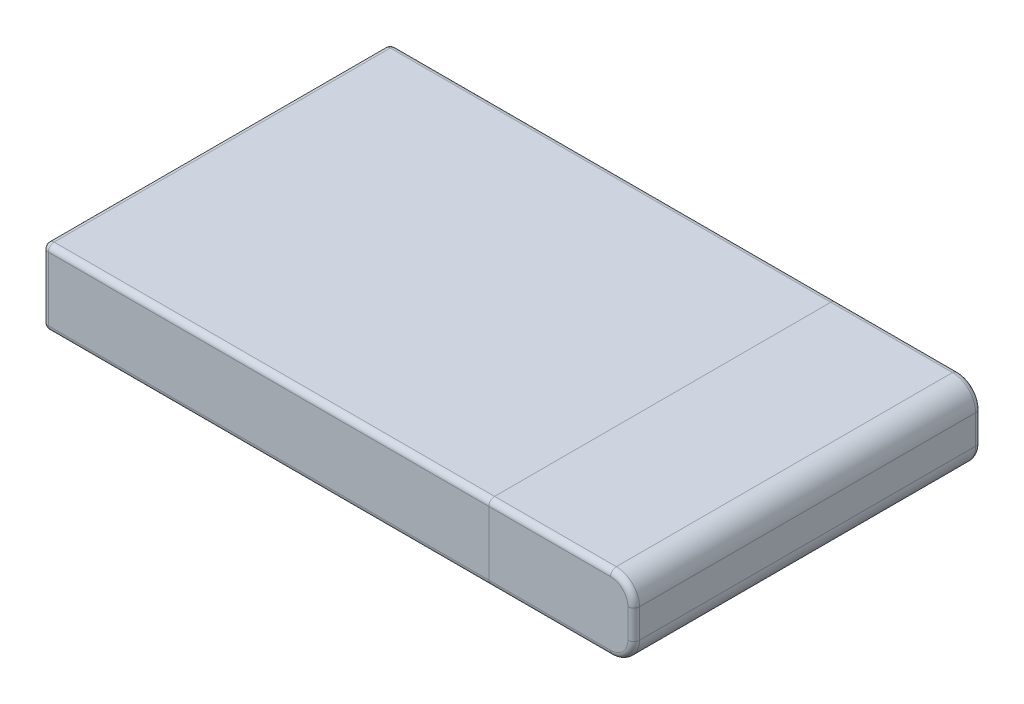
ISO-10303-21;
HEADER;
FILE_DESCRIPTION(('STEP AP214'),'2;1');
FILE_NAME('part.step','',(''),(''),'','','');
FILE_SCHEMA(('AUTOMOTIVE_DESIGN { 1 0 10303 214 1 1 1 1 }'));
ENDSEC;
DATA;
#1=APPLICATION_CONTEXT('core data for automotive mechanical design processes');
#2=APPLICATION_PROTOCOL_DEFINITION('international standard','automotive_design',2000,#1);
#3=PRODUCT_CONTEXT('',#1,'mechanical');
#4=PRODUCT('Part','Part','',(#3));
#5=PRODUCT_RELATED_PRODUCT_CATEGORY('part','',(#4));
#6=PRODUCT_DEFINITION_FORMATION('','',#4);
#7=PRODUCT_DEFINITION_CONTEXT('part definition',#1,'design');
#8=PRODUCT_DEFINITION('design','',#6,#7);
#9=PRODUCT_DEFINITION_SHAPE('','',#8);
#10=(LENGTH_UNIT() NAMED_UNIT(*) SI_UNIT(.MILLI.,.METRE.));
#11=(NAMED_UNIT(*) PLANE_ANGLE_UNIT() SI_UNIT($,.RADIAN.));
#12=(NAMED_UNIT(*) SI_UNIT($,.STERADIAN.) SOLID_ANGLE_UNIT());
#13=UNCERTAINTY_MEASURE_WITH_UNIT(LENGTH_MEASURE(1.E-05),#10,'distance_accuracy_value','');
#14=(GEOMETRIC_REPRESENTATION_CONTEXT(3) GLOBAL_UNCERTAINTY_ASSIGNED_CONTEXT((#13)) GLOBAL_UNIT_ASSIGNED_CONTEXT((#10,
#11,#12)) REPRESENTATION_CONTEXT('',''));
#15=CARTESIAN_POINT('',(0.,0.,0.));
#16=DIRECTION('',(0.,0.,1.));
#17=DIRECTION('',(1.,0.,0.));
#18=AXIS2_PLACEMENT_3D('',#15,#16,#17);
#19=CARTESIAN_POINT('',(31.75,-3.25,15.));
#20=DIRECTION('',(0.,0.,-1.));
#21=DIRECTION('',(-1.,0.,0.));
#22=AXIS2_PLACEMENT_3D('',#19,#20,#21);
#23=PLANE('',#22);
#24=DIRECTION('',(0.,-1.,0.));
#25=VECTOR('',#24,1.);
#26=CARTESIAN_POINT('',(19.25,-3.25,15.));
#27=LINE('',#26,#25);
#28=CARTESIAN_POINT('',(19.25,2.75,15.));
#29=VERTEX_POINT('',#28);
#30=CARTESIAN_POINT('',(19.25,-2.75,15.));
#31=VERTEX_POINT('',#30);
#32=EDGE_CURVE('E196',#29,#31,#27,.T.);
#33=ORIENTED_EDGE('',*,*,#32,.T.);
#34=DIRECTION('',(-1.,0.,0.));
#35=VECTOR('',#34,1.);
#36=CARTESIAN_POINT('',(31.75,-2.75,15.));
#37=LINE('',#36,#35);
#38=CARTESIAN_POINT('',(29.75,-2.75,15.));
#39=VERTEX_POINT('',#38);
#40=EDGE_CURVE('E160',#31,#39,#37,.F.);
#41=ORIENTED_EDGE('',*,*,#40,.T.);
#42=CARTESIAN_POINT('',(29.75,-1.25,15.));
#43=DIRECTION('',(0.,0.,-1.));
#44=DIRECTION('',(-1.,0.,0.));
#45=AXIS2_PLACEMENT_3D('',#42,#43,#44);
#46=CIRCLE('',#45,1.5);
#47=CARTESIAN_POINT('',(31.25,-1.25,15.));
#48=VERTEX_POINT('',#47);
#49=EDGE_CURVE('E234',#39,#48,#46,.F.);
#50=ORIENTED_EDGE('',*,*,#49,.T.);
#51=DIRECTION('',(0.,-1.,0.));
#52=VECTOR('',#51,1.);
#53=CARTESIAN_POINT('',(31.25,-3.25,15.));
#54=LINE('',#53,#52);
#55=CARTESIAN_POINT('',(31.25,1.25,15.));
#56=VERTEX_POINT('',#55);
#57=EDGE_CURVE('E232',#48,#56,#54,.F.);
#58=ORIENTED_EDGE('',*,*,#57,.T.);
#59=CARTESIAN_POINT('',(29.75,1.25,15.));
#60=DIRECTION('',(0.,0.,-1.));
#61=DIRECTION('',(-1.,0.,0.));
#62=AXIS2_PLACEMENT_3D('',#59,#60,#61);
#63=CIRCLE('',#62,1.5);
#64=CARTESIAN_POINT('',(29.75,2.75,15.));
#65=VERTEX_POINT('',#64);
#66=EDGE_CURVE('E230',#56,#65,#63,.F.);
#67=ORIENTED_EDGE('',*,*,#66,.T.);
#68=DIRECTION('',(-1.,0.,0.));
#69=VECTOR('',#68,1.);
#70=CARTESIAN_POINT('',(31.75,2.75,15.));
#71=LINE('',#70,#69);
#72=EDGE_CURVE('E228',#65,#29,#71,.T.);
#73=ORIENTED_EDGE('',*,*,#72,.T.);
#74=EDGE_LOOP('',(#33,#41,#50,#58,#67,#73));
#75=FACE_BOUND('',#74,.T.);
#76=ADVANCED_FACE('F40',(#75),#23,.F.);
#77=CARTESIAN_POINT('',(31.75,-3.25,15.));
#78=DIRECTION('',(0.,1.,0.));
#79=DIRECTION('',(0.,0.,1.));
#80=AXIS2_PLACEMENT_3D('',#77,#78,#79);
#81=PLANE('',#80);
#82=DIRECTION('',(0.,0.,-1.));
#83=VECTOR('',#82,1.);
#84=CARTESIAN_POINT('',(29.75,-3.25,15.));
#85=LINE('',#84,#83);
#86=CARTESIAN_POINT('',(29.75,-3.25,-14.5));
#87=VERTEX_POINT('',#86);
#88=CARTESIAN_POINT('',(29.75,-3.25,14.5));
#89=VERTEX_POINT('',#88);
#90=EDGE_CURVE('E135',#87,#89,#85,.F.);
#91=ORIENTED_EDGE('',*,*,#90,.T.);
#92=DIRECTION('',(-1.,0.,0.));
#93=VECTOR('',#92,1.);
#94=CARTESIAN_POINT('',(31.75,-3.25,14.5));
#95=LINE('',#94,#93);
#96=CARTESIAN_POINT('',(19.25,-3.25,14.5));
#97=VERTEX_POINT('',#96);
#98=EDGE_CURVE('E141',#89,#97,#95,.T.);
#99=ORIENTED_EDGE('',*,*,#98,.T.);
#100=DIRECTION('',(0.,0.,-1.));
#101=VECTOR('',#100,1.);
#102=CARTESIAN_POINT('',(19.25,-3.25,15.));
#103=LINE('',#102,#101);
#104=CARTESIAN_POINT('',(19.25,-3.25,-14.5));
#105=VERTEX_POINT('',#104);
#106=EDGE_CURVE('E138',#97,#105,#103,.T.);
#107=ORIENTED_EDGE('',*,*,#106,.T.);
#108=DIRECTION('',(-1.,0.,0.));
#109=VECTOR('',#108,1.);
#110=CARTESIAN_POINT('',(31.75,-3.25,-14.5));
#111=LINE('',#110,#109);
#112=EDGE_CURVE('E131',#105,#87,#111,.F.);
#113=ORIENTED_EDGE('',*,*,#112,.T.);
#114=EDGE_LOOP('',(#91,#99,#107,#113));
#115=FACE_BOUND('',#114,.T.);
#116=ADVANCED_FACE('F133',(#115),#81,.F.);
#117=CARTESIAN_POINT('',(31.75,-3.25,-15.));
#118=DIRECTION('',(0.,0.,1.));
#119=DIRECTION('',(1.,0.,0.));
#120=AXIS2_PLACEMENT_3D('',#117,#118,#119);
#121=PLANE('',#120);
#122=CARTESIAN_POINT('',(29.75,-1.25,-15.));
#123=DIRECTION('',(0.,0.,1.));
#124=DIRECTION('',(1.,0.,0.));
#125=AXIS2_PLACEMENT_3D('',#122,#123,#124);
#126=CIRCLE('',#125,1.5);
#127=CARTESIAN_POINT('',(31.25,-1.25,-15.));
#128=VERTEX_POINT('',#127);
#129=CARTESIAN_POINT('',(29.75,-2.75,-15.));
#130=VERTEX_POINT('',#129);
#131=EDGE_CURVE('E57',#128,#130,#126,.F.);
#132=ORIENTED_EDGE('',*,*,#131,.T.);
#133=DIRECTION('',(-1.,0.,0.));
#134=VECTOR('',#133,1.);
#135=CARTESIAN_POINT('',(31.75,-2.75,-15.));
#136=LINE('',#135,#134);
#137=CARTESIAN_POINT('',(19.25,-2.75,-15.));
#138=VERTEX_POINT('',#137);
#139=EDGE_CURVE('E163',#130,#138,#136,.T.);
#140=ORIENTED_EDGE('',*,*,#139,.T.);
#141=DIRECTION('',(0.,1.,0.));
#142=VECTOR('',#141,1.);
#143=CARTESIAN_POINT('',(19.25,-3.25,-15.));
#144=LINE('',#143,#142);
#145=CARTESIAN_POINT('',(19.25,2.75,-15.));
#146=VERTEX_POINT('',#145);
#147=EDGE_CURVE('E205',#138,#146,#144,.T.);
#148=ORIENTED_EDGE('',*,*,#147,.T.);
#149=DIRECTION('',(-1.,0.,0.));
#150=VECTOR('',#149,1.);
#151=CARTESIAN_POINT('',(31.75,2.75,-15.));
#152=LINE('',#151,#150);
#153=CARTESIAN_POINT('',(29.75,2.75,-15.));
#154=VERTEX_POINT('',#153);
#155=EDGE_CURVE('E246',#146,#154,#152,.F.);
#156=ORIENTED_EDGE('',*,*,#155,.T.);
#157=CARTESIAN_POINT('',(29.75,1.25,-15.));
#158=DIRECTION('',(0.,0.,1.));
#159=DIRECTION('',(1.,0.,0.));
#160=AXIS2_PLACEMENT_3D('',#157,#158,#159);
#161=CIRCLE('',#160,1.5);
#162=CARTESIAN_POINT('',(31.25,1.25,-15.));
#163=VERTEX_POINT('',#162);
#164=EDGE_CURVE('E248',#154,#163,#161,.F.);
#165=ORIENTED_EDGE('',*,*,#164,.T.);
#166=DIRECTION('',(0.,1.,0.));
#167=VECTOR('',#166,1.);
#168=CARTESIAN_POINT('',(31.25,-3.25,-15.));
#169=LINE('',#168,#167);
#170=EDGE_CURVE('E62',#163,#128,#169,.F.);
#171=ORIENTED_EDGE('',*,*,#170,.T.);
#172=EDGE_LOOP('',(#132,#140,#148,#156,#165,#171));
#173=FACE_BOUND('',#172,.T.);
#174=ADVANCED_FACE('F265',(#173),#121,.F.);
#175=CARTESIAN_POINT('',(31.75,3.25,15.));
#176=DIRECTION('',(0.,-1.,0.));
#177=DIRECTION('',(0.,0.,-1.));
#178=AXIS2_PLACEMENT_3D('',#175,#176,#177);
#179=PLANE('',#178);
#180=DIRECTION('',(0.,0.,1.));
#181=VECTOR('',#180,1.);
#182=CARTESIAN_POINT('',(19.25,3.25,15.));
#183=LINE('',#182,#181);
#184=CARTESIAN_POINT('',(19.25,3.25,-14.5));
#185=VERTEX_POINT('',#184);
#186=CARTESIAN_POINT('',(19.25,3.25,14.5));
#187=VERTEX_POINT('',#186);
#188=EDGE_CURVE('E210',#185,#187,#183,.T.);
#189=ORIENTED_EDGE('',*,*,#188,.T.);
#190=DIRECTION('',(-1.,0.,0.));
#191=VECTOR('',#190,1.);
#192=CARTESIAN_POINT('',(31.75,3.25,14.5));
#193=LINE('',#192,#191);
#194=CARTESIAN_POINT('',(29.75,3.25,14.5));
#195=VERTEX_POINT('',#194);
#196=EDGE_CURVE('E12',#187,#195,#193,.F.);
#197=ORIENTED_EDGE('',*,*,#196,.T.);
#198=DIRECTION('',(0.,0.,1.));
#199=VECTOR('',#198,1.);
#200=CARTESIAN_POINT('',(29.75,3.25,15.));
#201=LINE('',#200,#199);
#202=CARTESIAN_POINT('',(29.75,3.25,-14.5));
#203=VERTEX_POINT('',#202);
#204=EDGE_CURVE('E142',#195,#203,#201,.F.);
#205=ORIENTED_EDGE('',*,*,#204,.T.);
#206=DIRECTION('',(-1.,0.,0.));
#207=VECTOR('',#206,1.);
#208=CARTESIAN_POINT('',(31.75,3.25,-14.5));
#209=LINE('',#208,#207);
#210=EDGE_CURVE('E49',#203,#185,#209,.T.);
#211=ORIENTED_EDGE('',*,*,#210,.T.);
#212=EDGE_LOOP('',(#189,#197,#205,#211));
#213=FACE_BOUND('',#212,.T.);
#214=ADVANCED_FACE('F255',(#213),#179,.F.);
#215=CARTESIAN_POINT('',(31.75,3.25,15.));
#216=DIRECTION('',(-1.,0.,0.));
#217=DIRECTION('',(0.,0.,1.));
#218=AXIS2_PLACEMENT_3D('',#215,#216,#217);
#219=PLANE('',#218);
#220=DIRECTION('',(0.,0.,1.));
#221=VECTOR('',#220,1.);
#222=CARTESIAN_POINT('',(31.75,1.25,15.));
#223=LINE('',#222,#221);
#224=CARTESIAN_POINT('',(31.75,1.25,-14.5));
#225=VERTEX_POINT('',#224);
#226=CARTESIAN_POINT('',(31.75,1.25,14.5));
#227=VERTEX_POINT('',#226);
#228=EDGE_CURVE('E213',#225,#227,#223,.T.);
#229=ORIENTED_EDGE('',*,*,#228,.T.);
#230=DIRECTION('',(0.,-1.,0.));
#231=VECTOR('',#230,1.);
#232=CARTESIAN_POINT('',(31.75,3.25,14.5));
#233=LINE('',#232,#231);
#234=CARTESIAN_POINT('',(31.75,-1.25,14.5));
#235=VERTEX_POINT('',#234);
#236=EDGE_CURVE('E240',#227,#235,#233,.T.);
#237=ORIENTED_EDGE('',*,*,#236,.T.);
#238=DIRECTION('',(0.,0.,-1.));
#239=VECTOR('',#238,1.);
#240=CARTESIAN_POINT('',(31.75,-1.25,15.));
#241=LINE('',#240,#239);
#242=CARTESIAN_POINT('',(31.75,-1.25,-14.5));
#243=VERTEX_POINT('',#242);
#244=EDGE_CURVE('E152',#235,#243,#241,.T.);
#245=ORIENTED_EDGE('',*,*,#244,.T.);
#246=DIRECTION('',(0.,1.,0.));
#247=VECTOR('',#246,1.);
#248=CARTESIAN_POINT('',(31.75,3.25,-14.5));
#249=LINE('',#248,#247);
#250=EDGE_CURVE('E238',#243,#225,#249,.T.);
#251=ORIENTED_EDGE('',*,*,#250,.T.);
#252=EDGE_LOOP('',(#229,#237,#245,#251));
#253=FACE_BOUND('',#252,.T.);
#254=ADVANCED_FACE('F278',(#253),#219,.F.);
#255=CARTESIAN_POINT('',(19.25,3.25,15.));
#256=DIRECTION('',(-1.,0.,0.));
#257=DIRECTION('',(0.,0.,1.));
#258=AXIS2_PLACEMENT_3D('',#255,#256,#257);
#259=PLANE('',#258);
#260=ORIENTED_EDGE('',*,*,#106,.F.);
#261=CARTESIAN_POINT('',(19.25,-2.75,14.5));
#262=DIRECTION('',(-1.,0.,0.));
#263=DIRECTION('',(0.,0.,1.));
#264=AXIS2_PLACEMENT_3D('',#261,#262,#263);
#265=CIRCLE('',#264,0.5);
#266=EDGE_CURVE('E226',#97,#31,#265,.T.);
#267=ORIENTED_EDGE('',*,*,#266,.T.);
#268=ORIENTED_EDGE('',*,*,#32,.F.);
#269=CARTESIAN_POINT('',(19.25,2.75,14.5));
#270=DIRECTION('',(-1.,0.,0.));
#271=DIRECTION('',(0.,0.,1.));
#272=AXIS2_PLACEMENT_3D('',#269,#270,#271);
#273=CIRCLE('',#272,0.5);
#274=EDGE_CURVE('E222',#29,#187,#273,.T.);
#275=ORIENTED_EDGE('',*,*,#274,.T.);
#276=ORIENTED_EDGE('',*,*,#188,.F.);
#277=CARTESIAN_POINT('',(19.25,2.75,-14.5));
#278=DIRECTION('',(-1.,0.,0.));
#279=DIRECTION('',(0.,0.,1.));
#280=AXIS2_PLACEMENT_3D('',#277,#278,#279);
#281=CIRCLE('',#280,0.5);
#282=EDGE_CURVE('E220',#185,#146,#281,.T.);
#283=ORIENTED_EDGE('',*,*,#282,.T.);
#284=ORIENTED_EDGE('',*,*,#147,.F.);
#285=CARTESIAN_POINT('',(19.25,-2.75,-14.5));
#286=DIRECTION('',(-1.,0.,0.));
#287=DIRECTION('',(0.,0.,1.));
#288=AXIS2_PLACEMENT_3D('',#285,#286,#287);
#289=CIRCLE('',#288,0.5);
#290=EDGE_CURVE('E224',#138,#105,#289,.T.);
#291=ORIENTED_EDGE('',*,*,#290,.T.);
#292=EDGE_LOOP('',(#260,#267,#268,#275,#276,#283,#284,#291));
#293=FACE_BOUND('',#292,.T.);
#294=ADVANCED_FACE('F261',(#293),#259,.T.);
#295=CARTESIAN_POINT('',(29.75,-1.25,15.));
#296=DIRECTION('',(0.,0.,-1.));
#297=DIRECTION('',(-1.,0.,0.));
#298=AXIS2_PLACEMENT_3D('',#295,#296,#297);
#299=CYLINDRICAL_SURFACE('',#298,2.);
#300=ORIENTED_EDGE('',*,*,#244,.F.);
#301=CARTESIAN_POINT('',(29.75,-1.25,14.5));
#302=DIRECTION('',(0.,0.,-1.));
#303=DIRECTION('',(-1.,0.,0.));
#304=AXIS2_PLACEMENT_3D('',#301,#302,#303);
#305=CIRCLE('',#304,2.);
#306=EDGE_CURVE('E151',#235,#89,#305,.T.);
#307=ORIENTED_EDGE('',*,*,#306,.T.);
#308=ORIENTED_EDGE('',*,*,#90,.F.);
#309=CARTESIAN_POINT('',(29.75,-1.25,-14.5));
#310=DIRECTION('',(0.,0.,1.));
#311=DIRECTION('',(1.,0.,0.));
#312=AXIS2_PLACEMENT_3D('',#309,#310,#311);
#313=CIRCLE('',#312,2.);
#314=EDGE_CURVE('E148',#87,#243,#313,.T.);
#315=ORIENTED_EDGE('',*,*,#314,.T.);
#316=EDGE_LOOP('',(#300,#307,#308,#315));
#317=FACE_BOUND('',#316,.T.);
#318=ADVANCED_FACE('F147',(#317),#299,.T.);
#319=CARTESIAN_POINT('',(29.75,1.25,15.));
#320=DIRECTION('',(0.,0.,1.));
#321=DIRECTION('',(1.,0.,0.));
#322=AXIS2_PLACEMENT_3D('',#319,#320,#321);
#323=CYLINDRICAL_SURFACE('',#322,2.);
#324=ORIENTED_EDGE('',*,*,#204,.F.);
#325=CARTESIAN_POINT('',(29.75,1.25,14.5));
#326=DIRECTION('',(0.,0.,-1.));
#327=DIRECTION('',(-1.,0.,0.));
#328=AXIS2_PLACEMENT_3D('',#325,#326,#327);
#329=CIRCLE('',#328,2.);
#330=EDGE_CURVE('E244',#195,#227,#329,.T.);
#331=ORIENTED_EDGE('',*,*,#330,.T.);
#332=ORIENTED_EDGE('',*,*,#228,.F.);
#333=CARTESIAN_POINT('',(29.75,1.25,-14.5));
#334=DIRECTION('',(0.,0.,1.));
#335=DIRECTION('',(1.,0.,0.));
#336=AXIS2_PLACEMENT_3D('',#333,#334,#335);
#337=CIRCLE('',#336,2.);
#338=EDGE_CURVE('E242',#225,#203,#337,.T.);
#339=ORIENTED_EDGE('',*,*,#338,.T.);
#340=EDGE_LOOP('',(#324,#331,#332,#339));
#341=FACE_BOUND('',#340,.T.);
#342=ADVANCED_FACE('F276',(#341),#323,.T.);
#343=CARTESIAN_POINT('',(31.75,2.75,14.5));
#344=DIRECTION('',(-1.,0.,0.));
#345=DIRECTION('',(0.,0.,1.));
#346=AXIS2_PLACEMENT_3D('',#343,#344,#345);
#347=CYLINDRICAL_SURFACE('',#346,0.5);
#348=ORIENTED_EDGE('',*,*,#274,.F.);
#349=ORIENTED_EDGE('',*,*,#72,.F.);
#350=CARTESIAN_POINT('',(29.75,2.75,14.5));
#351=DIRECTION('',(1.,0.,0.));
#352=DIRECTION('',(0.,0.,-1.));
#353=AXIS2_PLACEMENT_3D('',#350,#351,#352);
#354=CIRCLE('',#353,0.5);
#355=EDGE_CURVE('E168',#195,#65,#354,.T.);
#356=ORIENTED_EDGE('',*,*,#355,.F.);
#357=ORIENTED_EDGE('',*,*,#196,.F.);
#358=EDGE_LOOP('',(#348,#349,#356,#357));
#359=FACE_BOUND('',#358,.T.);
#360=ADVANCED_FACE('F300',(#359),#347,.T.);
#361=CARTESIAN_POINT('',(29.75,1.25,14.5));
#362=DIRECTION('',(0.,0.,-1.));
#363=DIRECTION('',(-1.,0.,0.));
#364=AXIS2_PLACEMENT_3D('',#361,#362,#363);
#365=TOROIDAL_SURFACE('',#364,1.5,0.5);
#366=ORIENTED_EDGE('',*,*,#355,.T.);
#367=ORIENTED_EDGE('',*,*,#66,.F.);
#368=CARTESIAN_POINT('',(31.25,1.25,14.5));
#369=DIRECTION('',(0.,-1.,0.));
#370=DIRECTION('',(0.,0.,-1.));
#371=AXIS2_PLACEMENT_3D('',#368,#369,#370);
#372=CIRCLE('',#371,0.5);
#373=EDGE_CURVE('E187',#227,#56,#372,.T.);
#374=ORIENTED_EDGE('',*,*,#373,.F.);
#375=ORIENTED_EDGE('',*,*,#330,.F.);
#376=EDGE_LOOP('',(#366,#367,#374,#375));
#377=FACE_BOUND('',#376,.T.);
#378=ADVANCED_FACE('F273',(#377),#365,.T.);
#379=CARTESIAN_POINT('',(31.25,3.25,14.5));
#380=DIRECTION('',(0.,-1.,0.));
#381=DIRECTION('',(0.,0.,-1.));
#382=AXIS2_PLACEMENT_3D('',#379,#380,#381);
#383=CYLINDRICAL_SURFACE('',#382,0.5);
#384=ORIENTED_EDGE('',*,*,#373,.T.);
#385=ORIENTED_EDGE('',*,*,#57,.F.);
#386=CARTESIAN_POINT('',(31.25,-1.25,14.5));
#387=DIRECTION('',(0.,-1.,0.));
#388=DIRECTION('',(0.,0.,-1.));
#389=AXIS2_PLACEMENT_3D('',#386,#387,#388);
#390=CIRCLE('',#389,0.5);
#391=EDGE_CURVE('E181',#235,#48,#390,.T.);
#392=ORIENTED_EDGE('',*,*,#391,.F.);
#393=ORIENTED_EDGE('',*,*,#236,.F.);
#394=EDGE_LOOP('',(#384,#385,#392,#393));
#395=FACE_BOUND('',#394,.T.);
#396=ADVANCED_FACE('F271',(#395),#383,.T.);
#397=CARTESIAN_POINT('',(29.75,-1.25,14.5));
#398=DIRECTION('',(0.,0.,-1.));
#399=DIRECTION('',(-1.,0.,0.));
#400=AXIS2_PLACEMENT_3D('',#397,#398,#399);
#401=TOROIDAL_SURFACE('',#400,1.5,0.5);
#402=ORIENTED_EDGE('',*,*,#391,.T.);
#403=ORIENTED_EDGE('',*,*,#49,.F.);
#404=CARTESIAN_POINT('',(29.75,-2.75,14.5));
#405=DIRECTION('',(-1.,0.,0.));
#406=DIRECTION('',(0.,0.,1.));
#407=AXIS2_PLACEMENT_3D('',#404,#405,#406);
#408=CIRCLE('',#407,0.5);
#409=EDGE_CURVE('E175',#89,#39,#408,.T.);
#410=ORIENTED_EDGE('',*,*,#409,.F.);
#411=ORIENTED_EDGE('',*,*,#306,.F.);
#412=EDGE_LOOP('',(#402,#403,#410,#411));
#413=FACE_BOUND('',#412,.T.);
#414=ADVANCED_FACE('F269',(#413),#401,.T.);
#415=CARTESIAN_POINT('',(31.75,-2.75,14.5));
#416=DIRECTION('',(-1.,0.,0.));
#417=DIRECTION('',(0.,0.,1.));
#418=AXIS2_PLACEMENT_3D('',#415,#416,#417);
#419=CYLINDRICAL_SURFACE('',#418,0.5);
#420=ORIENTED_EDGE('',*,*,#409,.T.);
#421=ORIENTED_EDGE('',*,*,#40,.F.);
#422=ORIENTED_EDGE('',*,*,#266,.F.);
#423=ORIENTED_EDGE('',*,*,#98,.F.);
#424=EDGE_LOOP('',(#420,#421,#422,#423));
#425=FACE_BOUND('',#424,.T.);
#426=ADVANCED_FACE('F266',(#425),#419,.T.);
#427=CARTESIAN_POINT('',(31.75,2.75,-14.5));
#428=DIRECTION('',(-1.,0.,0.));
#429=DIRECTION('',(0.,0.,1.));
#430=AXIS2_PLACEMENT_3D('',#427,#428,#429);
#431=CYLINDRICAL_SURFACE('',#430,0.5);
#432=ORIENTED_EDGE('',*,*,#282,.F.);
#433=ORIENTED_EDGE('',*,*,#210,.F.);
#434=CARTESIAN_POINT('',(29.75,2.75,-14.5));
#435=DIRECTION('',(1.,0.,0.));
#436=DIRECTION('',(0.,0.,-1.));
#437=AXIS2_PLACEMENT_3D('',#434,#435,#436);
#438=CIRCLE('',#437,0.5);
#439=EDGE_CURVE('E44',#154,#203,#438,.T.);
#440=ORIENTED_EDGE('',*,*,#439,.F.);
#441=ORIENTED_EDGE('',*,*,#155,.F.);
#442=EDGE_LOOP('',(#432,#433,#440,#441));
#443=FACE_BOUND('',#442,.T.);
#444=ADVANCED_FACE('F42',(#443),#431,.T.);
#445=CARTESIAN_POINT('',(29.75,1.25,-14.5));
#446=DIRECTION('',(0.,0.,1.));
#447=DIRECTION('',(1.,0.,0.));
#448=AXIS2_PLACEMENT_3D('',#445,#446,#447);
#449=TOROIDAL_SURFACE('',#448,1.5,0.5);
#450=ORIENTED_EDGE('',*,*,#439,.T.);
#451=ORIENTED_EDGE('',*,*,#338,.F.);
#452=CARTESIAN_POINT('',(31.25,1.25,-14.5));
#453=DIRECTION('',(0.,-1.,0.));
#454=DIRECTION('',(0.,0.,-1.));
#455=AXIS2_PLACEMENT_3D('',#452,#453,#454);
#456=CIRCLE('',#455,0.5);
#457=EDGE_CURVE('E165',#163,#225,#456,.T.);
#458=ORIENTED_EDGE('',*,*,#457,.F.);
#459=ORIENTED_EDGE('',*,*,#164,.F.);
#460=EDGE_LOOP('',(#450,#451,#458,#459));
#461=FACE_BOUND('',#460,.T.);
#462=ADVANCED_FACE('F281',(#461),#449,.T.);
#463=CARTESIAN_POINT('',(31.25,3.25,-14.5));
#464=DIRECTION('',(0.,1.,0.));
#465=DIRECTION('',(0.,0.,1.));
#466=AXIS2_PLACEMENT_3D('',#463,#464,#465);
#467=CYLINDRICAL_SURFACE('',#466,0.5);
#468=ORIENTED_EDGE('',*,*,#457,.T.);
#469=ORIENTED_EDGE('',*,*,#250,.F.);
#470=CARTESIAN_POINT('',(31.25,-1.25,-14.5));
#471=DIRECTION('',(0.,-1.,0.));
#472=DIRECTION('',(0.,0.,-1.));
#473=AXIS2_PLACEMENT_3D('',#470,#471,#472);
#474=CIRCLE('',#473,0.5);
#475=EDGE_CURVE('E159',#128,#243,#474,.T.);
#476=ORIENTED_EDGE('',*,*,#475,.F.);
#477=ORIENTED_EDGE('',*,*,#170,.F.);
#478=EDGE_LOOP('',(#468,#469,#476,#477));
#479=FACE_BOUND('',#478,.T.);
#480=ADVANCED_FACE('F279',(#479),#467,.T.);
#481=CARTESIAN_POINT('',(29.75,-1.25,-14.5));
#482=DIRECTION('',(0.,0.,1.));
#483=DIRECTION('',(1.,0.,0.));
#484=AXIS2_PLACEMENT_3D('',#481,#482,#483);
#485=TOROIDAL_SURFACE('',#484,1.5,0.5);
#486=ORIENTED_EDGE('',*,*,#475,.T.);
#487=ORIENTED_EDGE('',*,*,#314,.F.);
#488=CARTESIAN_POINT('',(29.75,-2.75,-14.5));
#489=DIRECTION('',(-1.,0.,0.));
#490=DIRECTION('',(0.,0.,1.));
#491=AXIS2_PLACEMENT_3D('',#488,#489,#490);
#492=CIRCLE('',#491,0.5);
#493=EDGE_CURVE('E157',#130,#87,#492,.T.);
#494=ORIENTED_EDGE('',*,*,#493,.F.);
#495=ORIENTED_EDGE('',*,*,#131,.F.);
#496=EDGE_LOOP('',(#486,#487,#494,#495));
#497=FACE_BOUND('',#496,.T.);
#498=ADVANCED_FACE('F156',(#497),#485,.T.);
#499=CARTESIAN_POINT('',(31.75,-2.75,-14.5));
#500=DIRECTION('',(-1.,0.,0.));
#501=DIRECTION('',(0.,0.,1.));
#502=AXIS2_PLACEMENT_3D('',#499,#500,#501);
#503=CYLINDRICAL_SURFACE('',#502,0.5);
#504=ORIENTED_EDGE('',*,*,#493,.T.);
#505=ORIENTED_EDGE('',*,*,#112,.F.);
#506=ORIENTED_EDGE('',*,*,#290,.F.);
#507=ORIENTED_EDGE('',*,*,#139,.F.);
#508=EDGE_LOOP('',(#504,#505,#506,#507));
#509=FACE_BOUND('',#508,.T.);
#510=ADVANCED_FACE('F162',(#509),#503,.T.);
#511=CLOSED_SHELL('',(#76,#116,#174,#214,#254,#294,#318,#342,#360,#378,#396,#414,#426,#444,#462,
#480,#498,#510));
#512=MANIFOLD_SOLID_BREP('B2',#511);
#513=CARTESIAN_POINT('',(-19.25,-3.25,15.));
#514=DIRECTION('',(-1.,0.,0.));
#515=DIRECTION('',(0.,0.,1.));
#516=AXIS2_PLACEMENT_3D('',#513,#514,#515);
#517=PLANE('',#516);
#518=DIRECTION('',(0.,0.,1.));
#519=VECTOR('',#518,1.);
#520=CARTESIAN_POINT('',(-19.25,-2.75,15.));
#521=LINE('',#520,#519);
#522=CARTESIAN_POINT('',(-19.25,-2.75,-14.5));
#523=VERTEX_POINT('',#522);
#524=CARTESIAN_POINT('',(-19.25,-2.75,14.5));
#525=VERTEX_POINT('',#524);
#526=EDGE_CURVE('E507',#523,#525,#521,.T.);
#527=ORIENTED_EDGE('',*,*,#526,.T.);
#528=DIRECTION('',(0.,1.,0.));
#529=VECTOR('',#528,1.);
#530=CARTESIAN_POINT('',(-19.25,-3.25,14.5));
#531=LINE('',#530,#529);
#532=CARTESIAN_POINT('',(-19.25,2.75,14.5));
#533=VERTEX_POINT('',#532);
#534=EDGE_CURVE('E544',#525,#533,#531,.T.);
#535=ORIENTED_EDGE('',*,*,#534,.T.);
#536=DIRECTION('',(0.,0.,1.));
#537=VECTOR('',#536,1.);
#538=CARTESIAN_POINT('',(-19.25,2.75,-15.));
#539=LINE('',#538,#537);
#540=CARTESIAN_POINT('',(-19.25,2.75,-14.5));
#541=VERTEX_POINT('',#540);
#542=EDGE_CURVE('E510',#533,#541,#539,.F.);
#543=ORIENTED_EDGE('',*,*,#542,.T.);
#544=DIRECTION('',(0.,1.,0.));
#545=VECTOR('',#544,1.);
#546=CARTESIAN_POINT('',(-19.25,-3.25,-14.5));
#547=LINE('',#546,#545);
#548=EDGE_CURVE('E503',#541,#523,#547,.F.);
#549=ORIENTED_EDGE('',*,*,#548,.T.);
#550=EDGE_LOOP('',(#527,#535,#543,#549));
#551=FACE_BOUND('',#550,.T.);
#552=ADVANCED_FACE('F427',(#551),#517,.T.);
#553=CARTESIAN_POINT('',(-19.25,-3.25,-15.));
#554=DIRECTION('',(0.,0.,-1.));
#555=DIRECTION('',(-1.,0.,0.));
#556=AXIS2_PLACEMENT_3D('',#553,#554,#555);
#557=PLANE('',#556);
#558=DIRECTION('',(0.,1.,0.));
#559=VECTOR('',#558,1.);
#560=CARTESIAN_POINT('',(19.25,-3.25,-15.));
#561=LINE('',#560,#559);
#562=CARTESIAN_POINT('',(19.25,-2.75,-15.));
#563=VERTEX_POINT('',#562);
#564=CARTESIAN_POINT('',(19.25,2.75,-15.));
#565=VERTEX_POINT('',#564);
#566=EDGE_CURVE('E536',#563,#565,#561,.T.);
#567=ORIENTED_EDGE('',*,*,#566,.F.);
#568=DIRECTION('',(-1.,0.,0.));
#569=VECTOR('',#568,1.);
#570=CARTESIAN_POINT('',(-19.25,-2.75,-15.));
#571=LINE('',#570,#569);
#572=CARTESIAN_POINT('',(-18.75,-2.75,-15.));
#573=VERTEX_POINT('',#572);
#574=EDGE_CURVE('E562',#563,#573,#571,.T.);
#575=ORIENTED_EDGE('',*,*,#574,.T.);
#576=DIRECTION('',(0.,1.,0.));
#577=VECTOR('',#576,1.);
#578=CARTESIAN_POINT('',(-18.75,-3.25,-15.));
#579=LINE('',#578,#577);
#580=CARTESIAN_POINT('',(-18.75,2.75,-15.));
#581=VERTEX_POINT('',#580);
#582=EDGE_CURVE('E520',#573,#581,#579,.T.);
#583=ORIENTED_EDGE('',*,*,#582,.T.);
#584=DIRECTION('',(-1.,0.,0.));
#585=VECTOR('',#584,1.);
#586=CARTESIAN_POINT('',(19.25,2.75,-15.));
#587=LINE('',#586,#585);
#588=EDGE_CURVE('E559',#581,#565,#587,.F.);
#589=ORIENTED_EDGE('',*,*,#588,.T.);
#590=EDGE_LOOP('',(#567,#575,#583,#589));
#591=FACE_BOUND('',#590,.T.);
#592=ADVANCED_FACE('F631',(#591),#557,.T.);
#593=CARTESIAN_POINT('',(19.25,-3.25,15.));
#594=DIRECTION('',(1.,0.,0.));
#595=DIRECTION('',(0.,0.,-1.));
#596=AXIS2_PLACEMENT_3D('',#593,#594,#595);
#597=PLANE('',#596);
#598=DIRECTION('',(0.,0.,-1.));
#599=VECTOR('',#598,1.);
#600=CARTESIAN_POINT('',(19.25,-3.25,15.));
#601=LINE('',#600,#599);
#602=CARTESIAN_POINT('',(19.25,-3.25,14.5));
#603=VERTEX_POINT('',#602);
#604=CARTESIAN_POINT('',(19.25,-3.25,-14.5));
#605=VERTEX_POINT('',#604);
#606=EDGE_CURVE('E621',#603,#605,#601,.T.);
#607=ORIENTED_EDGE('',*,*,#606,.T.);
#608=CARTESIAN_POINT('',(19.25,-2.75,-14.5));
#609=DIRECTION('',(1.,0.,0.));
#610=DIRECTION('',(0.,0.,-1.));
#611=AXIS2_PLACEMENT_3D('',#608,#609,#610);
#612=CIRCLE('',#611,0.5);
#613=EDGE_CURVE('E38',#605,#563,#612,.T.);
#614=ORIENTED_EDGE('',*,*,#613,.T.);
#615=ORIENTED_EDGE('',*,*,#566,.T.);
#616=CARTESIAN_POINT('',(19.25,2.75,-14.5));
#617=DIRECTION('',(1.,0.,0.));
#618=DIRECTION('',(0.,0.,-1.));
#619=AXIS2_PLACEMENT_3D('',#616,#617,#618);
#620=CIRCLE('',#619,0.5);
#621=CARTESIAN_POINT('',(19.25,3.25,-14.5));
#622=VERTEX_POINT('',#621);
#623=EDGE_CURVE('E436',#565,#622,#620,.T.);
#624=ORIENTED_EDGE('',*,*,#623,.T.);
#625=DIRECTION('',(0.,0.,-1.));
#626=VECTOR('',#625,1.);
#627=CARTESIAN_POINT('',(19.25,3.25,15.));
#628=LINE('',#627,#626);
#629=CARTESIAN_POINT('',(19.25,3.25,14.5));
#630=VERTEX_POINT('',#629);
#631=EDGE_CURVE('E617',#630,#622,#628,.T.);
#632=ORIENTED_EDGE('',*,*,#631,.F.);
#633=CARTESIAN_POINT('',(19.25,2.75,14.5));
#634=DIRECTION('',(1.,0.,0.));
#635=DIRECTION('',(0.,0.,-1.));
#636=AXIS2_PLACEMENT_3D('',#633,#634,#635);
#637=CIRCLE('',#636,0.5);
#638=CARTESIAN_POINT('',(19.25,2.75,15.));
#639=VERTEX_POINT('',#638);
#640=EDGE_CURVE('E568',#630,#639,#637,.T.);
#641=ORIENTED_EDGE('',*,*,#640,.T.);
#642=DIRECTION('',(0.,1.,0.));
#643=VECTOR('',#642,1.);
#644=CARTESIAN_POINT('',(19.25,-3.25,15.));
#645=LINE('',#644,#643);
#646=CARTESIAN_POINT('',(19.25,-2.75,15.));
#647=VERTEX_POINT('',#646);
#648=EDGE_CURVE('E539',#647,#639,#645,.T.);
#649=ORIENTED_EDGE('',*,*,#648,.F.);
#650=CARTESIAN_POINT('',(19.25,-2.75,14.5));
#651=DIRECTION('',(1.,0.,0.));
#652=DIRECTION('',(0.,0.,-1.));
#653=AXIS2_PLACEMENT_3D('',#650,#651,#652);
#654=CIRCLE('',#653,0.5);
#655=EDGE_CURVE('E570',#647,#603,#654,.T.);
#656=ORIENTED_EDGE('',*,*,#655,.T.);
#657=EDGE_LOOP('',(#607,#614,#615,#624,#632,#641,#649,#656));
#658=FACE_BOUND('',#657,.T.);
#659=ADVANCED_FACE('F615',(#658),#597,.T.);
#660=CARTESIAN_POINT('',(-19.25,-3.25,15.));
#661=DIRECTION('',(0.,0.,1.));
#662=DIRECTION('',(1.,0.,0.));
#663=AXIS2_PLACEMENT_3D('',#660,#661,#662);
#664=PLANE('',#663);
#665=DIRECTION('',(0.,1.,0.));
#666=VECTOR('',#665,1.);
#667=CARTESIAN_POINT('',(-18.75,-3.25,15.));
#668=LINE('',#667,#666);
#669=CARTESIAN_POINT('',(-18.75,2.75,15.));
#670=VERTEX_POINT('',#669);
#671=CARTESIAN_POINT('',(-18.75,-2.75,15.));
#672=VERTEX_POINT('',#671);
#673=EDGE_CURVE('E548',#670,#672,#668,.F.);
#674=ORIENTED_EDGE('',*,*,#673,.T.);
#675=DIRECTION('',(1.,0.,0.));
#676=VECTOR('',#675,1.);
#677=CARTESIAN_POINT('',(-19.25,-2.75,15.));
#678=LINE('',#677,#676);
#679=EDGE_CURVE('E551',#672,#647,#678,.T.);
#680=ORIENTED_EDGE('',*,*,#679,.T.);
#681=ORIENTED_EDGE('',*,*,#648,.T.);
#682=DIRECTION('',(1.,0.,0.));
#683=VECTOR('',#682,1.);
#684=CARTESIAN_POINT('',(-19.25,2.75,15.));
#685=LINE('',#684,#683);
#686=EDGE_CURVE('E546',#639,#670,#685,.F.);
#687=ORIENTED_EDGE('',*,*,#686,.T.);
#688=EDGE_LOOP('',(#674,#680,#681,#687));
#689=FACE_BOUND('',#688,.T.);
#690=ADVANCED_FACE('F619',(#689),#664,.T.);
#691=CARTESIAN_POINT('',(-19.25,-3.25,-15.));
#692=DIRECTION('',(0.,-1.,0.));
#693=DIRECTION('',(0.,0.,-1.));
#694=AXIS2_PLACEMENT_3D('',#691,#692,#693);
#695=PLANE('',#694);
#696=DIRECTION('',(0.,0.,1.));
#697=VECTOR('',#696,1.);
#698=CARTESIAN_POINT('',(-18.75,-3.25,-15.));
#699=LINE('',#698,#697);
#700=CARTESIAN_POINT('',(-18.75,-3.25,14.5));
#701=VERTEX_POINT('',#700);
#702=CARTESIAN_POINT('',(-18.75,-3.25,-14.5));
#703=VERTEX_POINT('',#702);
#704=EDGE_CURVE('E444',#701,#703,#699,.F.);
#705=ORIENTED_EDGE('',*,*,#704,.T.);
#706=DIRECTION('',(-1.,0.,0.));
#707=VECTOR('',#706,1.);
#708=CARTESIAN_POINT('',(-19.25,-3.25,-14.5));
#709=LINE('',#708,#707);
#710=EDGE_CURVE('E566',#703,#605,#709,.F.);
#711=ORIENTED_EDGE('',*,*,#710,.T.);
#712=ORIENTED_EDGE('',*,*,#606,.F.);
#713=DIRECTION('',(1.,0.,0.));
#714=VECTOR('',#713,1.);
#715=CARTESIAN_POINT('',(-19.25,-3.25,14.5));
#716=LINE('',#715,#714);
#717=EDGE_CURVE('E449',#603,#701,#716,.F.);
#718=ORIENTED_EDGE('',*,*,#717,.T.);
#719=EDGE_LOOP('',(#705,#711,#712,#718));
#720=FACE_BOUND('',#719,.T.);
#721=ADVANCED_FACE('F634',(#720),#695,.T.);
#722=CARTESIAN_POINT('',(-19.25,3.25,-15.));
#723=DIRECTION('',(0.,-1.,0.));
#724=DIRECTION('',(0.,0.,-1.));
#725=AXIS2_PLACEMENT_3D('',#722,#723,#724);
#726=PLANE('',#725);
#727=ORIENTED_EDGE('',*,*,#631,.T.);
#728=DIRECTION('',(-1.,0.,0.));
#729=VECTOR('',#728,1.);
#730=CARTESIAN_POINT('',(-19.25,3.25,-14.5));
#731=LINE('',#730,#729);
#732=CARTESIAN_POINT('',(-18.75,3.25,-14.5));
#733=VERTEX_POINT('',#732);
#734=EDGE_CURVE('E557',#622,#733,#731,.T.);
#735=ORIENTED_EDGE('',*,*,#734,.T.);
#736=DIRECTION('',(0.,0.,1.));
#737=VECTOR('',#736,1.);
#738=CARTESIAN_POINT('',(-18.75,3.25,15.));
#739=LINE('',#738,#737);
#740=CARTESIAN_POINT('',(-18.75,3.25,14.5));
#741=VERTEX_POINT('',#740);
#742=EDGE_CURVE('E555',#733,#741,#739,.T.);
#743=ORIENTED_EDGE('',*,*,#742,.T.);
#744=DIRECTION('',(1.,0.,0.));
#745=VECTOR('',#744,1.);
#746=CARTESIAN_POINT('',(19.25,3.25,14.5));
#747=LINE('',#746,#745);
#748=EDGE_CURVE('E553',#741,#630,#747,.T.);
#749=ORIENTED_EDGE('',*,*,#748,.T.);
#750=EDGE_LOOP('',(#727,#735,#743,#749));
#751=FACE_BOUND('',#750,.T.);
#752=ADVANCED_FACE('F602',(#751),#726,.F.);
#753=CARTESIAN_POINT('',(-19.25,-2.75,-14.5));
#754=DIRECTION('',(-1.,0.,0.));
#755=DIRECTION('',(0.,0.,1.));
#756=AXIS2_PLACEMENT_3D('',#753,#754,#755);
#757=CYLINDRICAL_SURFACE('',#756,0.5);
#758=ORIENTED_EDGE('',*,*,#613,.F.);
#759=ORIENTED_EDGE('',*,*,#710,.F.);
#760=CARTESIAN_POINT('',(-18.75,-2.75,-14.5));
#761=DIRECTION('',(-1.,0.,0.));
#762=DIRECTION('',(0.,0.,1.));
#763=AXIS2_PLACEMENT_3D('',#760,#761,#762);
#764=CIRCLE('',#763,0.5);
#765=EDGE_CURVE('E431',#573,#703,#764,.T.);
#766=ORIENTED_EDGE('',*,*,#765,.F.);
#767=ORIENTED_EDGE('',*,*,#574,.F.);
#768=EDGE_LOOP('',(#758,#759,#766,#767));
#769=FACE_BOUND('',#768,.T.);
#770=ADVANCED_FACE('F429',(#769),#757,.T.);
#771=CARTESIAN_POINT('',(-18.75,-3.25,-14.5));
#772=DIRECTION('',(0.,1.,0.));
#773=DIRECTION('',(0.,0.,1.));
#774=AXIS2_PLACEMENT_3D('',#771,#772,#773);
#775=CYLINDRICAL_SURFACE('',#774,0.5);
#776=CARTESIAN_POINT('',(-18.75,2.75,-14.5));
#777=DIRECTION('',(0.,1.,0.));
#778=DIRECTION('',(0.,0.,1.));
#779=AXIS2_PLACEMENT_3D('',#776,#777,#778);
#780=CIRCLE('',#779,0.5);
#781=EDGE_CURVE('E524',#581,#541,#780,.T.);
#782=ORIENTED_EDGE('',*,*,#781,.F.);
#783=ORIENTED_EDGE('',*,*,#582,.F.);
#784=CARTESIAN_POINT('',(-18.75,-2.75,-14.5));
#785=DIRECTION('',(0.,-1.,0.));
#786=DIRECTION('',(0.,0.,-1.));
#787=AXIS2_PLACEMENT_3D('',#784,#785,#786);
#788=CIRCLE('',#787,0.5);
#789=EDGE_CURVE('E517',#523,#573,#788,.T.);
#790=ORIENTED_EDGE('',*,*,#789,.F.);
#791=ORIENTED_EDGE('',*,*,#548,.F.);
#792=EDGE_LOOP('',(#782,#783,#790,#791));
#793=FACE_BOUND('',#792,.T.);
#794=ADVANCED_FACE('F519',(#793),#775,.T.);
#795=CARTESIAN_POINT('',(-19.25,2.75,-14.5));
#796=DIRECTION('',(1.,0.,0.));
#797=DIRECTION('',(0.,0.,-1.));
#798=AXIS2_PLACEMENT_3D('',#795,#796,#797);
#799=CYLINDRICAL_SURFACE('',#798,0.5);
#800=ORIENTED_EDGE('',*,*,#623,.F.);
#801=ORIENTED_EDGE('',*,*,#588,.F.);
#802=CARTESIAN_POINT('',(-18.75,2.75,-14.5));
#803=DIRECTION('',(-1.,0.,0.));
#804=DIRECTION('',(0.,0.,1.));
#805=AXIS2_PLACEMENT_3D('',#802,#803,#804);
#806=CIRCLE('',#805,0.5);
#807=EDGE_CURVE('E529',#733,#581,#806,.T.);
#808=ORIENTED_EDGE('',*,*,#807,.F.);
#809=ORIENTED_EDGE('',*,*,#734,.F.);
#810=EDGE_LOOP('',(#800,#801,#808,#809));
#811=FACE_BOUND('',#810,.T.);
#812=ADVANCED_FACE('F627',(#811),#799,.T.);
#813=CARTESIAN_POINT('',(-18.75,-2.75,-14.5));
#814=DIRECTION('',(0.,0.,1.));
#815=DIRECTION('',(1.,0.,0.));
#816=AXIS2_PLACEMENT_3D('',#813,#814,#815);
#817=SPHERICAL_SURFACE('',#816,0.5);
#818=ORIENTED_EDGE('',*,*,#789,.T.);
#819=ORIENTED_EDGE('',*,*,#765,.T.);
#820=CARTESIAN_POINT('',(-18.75,-2.75,-14.5));
#821=DIRECTION('',(0.,0.,-1.));
#822=DIRECTION('',(-1.,0.,0.));
#823=AXIS2_PLACEMENT_3D('',#820,#821,#822);
#824=CIRCLE('',#823,0.5);
#825=EDGE_CURVE('E526',#523,#703,#824,.F.);
#826=ORIENTED_EDGE('',*,*,#825,.F.);
#827=EDGE_LOOP('',(#818,#819,#826));
#828=FACE_BOUND('',#827,.T.);
#829=ADVANCED_FACE('F527',(#828),#817,.T.);
#830=CARTESIAN_POINT('',(-18.75,2.75,-14.5));
#831=DIRECTION('',(0.,0.,1.));
#832=DIRECTION('',(1.,0.,0.));
#833=AXIS2_PLACEMENT_3D('',#830,#831,#832);
#834=SPHERICAL_SURFACE('',#833,0.5);
#835=ORIENTED_EDGE('',*,*,#807,.T.);
#836=ORIENTED_EDGE('',*,*,#781,.T.);
#837=CARTESIAN_POINT('',(-18.75,2.75,-14.5));
#838=DIRECTION('',(0.,0.,-1.));
#839=DIRECTION('',(-1.,0.,0.));
#840=AXIS2_PLACEMENT_3D('',#837,#838,#839);
#841=CIRCLE('',#840,0.5);
#842=EDGE_CURVE('E530',#733,#541,#841,.F.);
#843=ORIENTED_EDGE('',*,*,#842,.F.);
#844=EDGE_LOOP('',(#835,#836,#843));
#845=FACE_BOUND('',#844,.T.);
#846=ADVANCED_FACE('F593',(#845),#834,.T.);
#847=CARTESIAN_POINT('',(-19.25,-2.75,14.5));
#848=DIRECTION('',(1.,0.,0.));
#849=DIRECTION('',(0.,0.,-1.));
#850=AXIS2_PLACEMENT_3D('',#847,#848,#849);
#851=CYLINDRICAL_SURFACE('',#850,0.5);
#852=ORIENTED_EDGE('',*,*,#655,.F.);
#853=ORIENTED_EDGE('',*,*,#679,.F.);
#854=CARTESIAN_POINT('',(-18.75,-2.75,14.5));
#855=DIRECTION('',(-1.,0.,0.));
#856=DIRECTION('',(0.,0.,1.));
#857=AXIS2_PLACEMENT_3D('',#854,#855,#856);
#858=CIRCLE('',#857,0.5);
#859=EDGE_CURVE('E584',#701,#672,#858,.T.);
#860=ORIENTED_EDGE('',*,*,#859,.F.);
#861=ORIENTED_EDGE('',*,*,#717,.F.);
#862=EDGE_LOOP('',(#852,#853,#860,#861));
#863=FACE_BOUND('',#862,.T.);
#864=ADVANCED_FACE('F637',(#863),#851,.T.);
#865=CARTESIAN_POINT('',(-18.75,-2.75,15.));
#866=DIRECTION('',(0.,0.,1.));
#867=DIRECTION('',(1.,0.,0.));
#868=AXIS2_PLACEMENT_3D('',#865,#866,#867);
#869=CYLINDRICAL_SURFACE('',#868,0.5);
#870=ORIENTED_EDGE('',*,*,#825,.T.);
#871=ORIENTED_EDGE('',*,*,#704,.F.);
#872=CARTESIAN_POINT('',(-18.75,-2.75,14.5));
#873=DIRECTION('',(0.,0.,1.));
#874=DIRECTION('',(1.,0.,0.));
#875=AXIS2_PLACEMENT_3D('',#872,#873,#874);
#876=CIRCLE('',#875,0.5);
#877=EDGE_CURVE('E534',#525,#701,#876,.T.);
#878=ORIENTED_EDGE('',*,*,#877,.F.);
#879=ORIENTED_EDGE('',*,*,#526,.F.);
#880=EDGE_LOOP('',(#870,#871,#878,#879));
#881=FACE_BOUND('',#880,.T.);
#882=ADVANCED_FACE('F532',(#881),#869,.T.);
#883=CARTESIAN_POINT('',(-18.75,2.75,-15.));
#884=DIRECTION('',(0.,0.,-1.));
#885=DIRECTION('',(-1.,0.,0.));
#886=AXIS2_PLACEMENT_3D('',#883,#884,#885);
#887=CYLINDRICAL_SURFACE('',#886,0.5);
#888=ORIENTED_EDGE('',*,*,#842,.T.);
#889=ORIENTED_EDGE('',*,*,#542,.F.);
#890=CARTESIAN_POINT('',(-18.75,2.75,14.5));
#891=DIRECTION('',(0.,0.,1.));
#892=DIRECTION('',(1.,0.,0.));
#893=AXIS2_PLACEMENT_3D('',#890,#891,#892);
#894=CIRCLE('',#893,0.5);
#895=EDGE_CURVE('E580',#741,#533,#894,.T.);
#896=ORIENTED_EDGE('',*,*,#895,.F.);
#897=ORIENTED_EDGE('',*,*,#742,.F.);
#898=EDGE_LOOP('',(#888,#889,#896,#897));
#899=FACE_BOUND('',#898,.T.);
#900=ADVANCED_FACE('F597',(#899),#887,.T.);
#901=CARTESIAN_POINT('',(-19.25,2.75,14.5));
#902=DIRECTION('',(-1.,0.,0.));
#903=DIRECTION('',(0.,0.,1.));
#904=AXIS2_PLACEMENT_3D('',#901,#902,#903);
#905=CYLINDRICAL_SURFACE('',#904,0.5);
#906=ORIENTED_EDGE('',*,*,#640,.F.);
#907=ORIENTED_EDGE('',*,*,#748,.F.);
#908=CARTESIAN_POINT('',(-18.75,2.75,14.5));
#909=DIRECTION('',(-1.,0.,0.));
#910=DIRECTION('',(0.,0.,1.));
#911=AXIS2_PLACEMENT_3D('',#908,#909,#910);
#912=CIRCLE('',#911,0.5);
#913=EDGE_CURVE('E577',#670,#741,#912,.T.);
#914=ORIENTED_EDGE('',*,*,#913,.F.);
#915=ORIENTED_EDGE('',*,*,#686,.F.);
#916=EDGE_LOOP('',(#906,#907,#914,#915));
#917=FACE_BOUND('',#916,.T.);
#918=ADVANCED_FACE('F608',(#917),#905,.T.);
#919=CARTESIAN_POINT('',(-18.75,-2.75,14.5));
#920=DIRECTION('',(0.,0.,1.));
#921=DIRECTION('',(1.,0.,0.));
#922=AXIS2_PLACEMENT_3D('',#919,#920,#921);
#923=SPHERICAL_SURFACE('',#922,0.5);
#924=ORIENTED_EDGE('',*,*,#877,.T.);
#925=ORIENTED_EDGE('',*,*,#859,.T.);
#926=CARTESIAN_POINT('',(-18.75,-2.75,14.5));
#927=DIRECTION('',(0.,-1.,0.));
#928=DIRECTION('',(0.,0.,-1.));
#929=AXIS2_PLACEMENT_3D('',#926,#927,#928);
#930=CIRCLE('',#929,0.5);
#931=EDGE_CURVE('E575',#525,#672,#930,.F.);
#932=ORIENTED_EDGE('',*,*,#931,.F.);
#933=EDGE_LOOP('',(#924,#925,#932));
#934=FACE_BOUND('',#933,.T.);
#935=ADVANCED_FACE('F639',(#934),#923,.T.);
#936=CARTESIAN_POINT('',(-18.75,2.75,14.5));
#937=DIRECTION('',(0.,0.,1.));
#938=DIRECTION('',(1.,0.,0.));
#939=AXIS2_PLACEMENT_3D('',#936,#937,#938);
#940=SPHERICAL_SURFACE('',#939,0.5);
#941=ORIENTED_EDGE('',*,*,#913,.T.);
#942=ORIENTED_EDGE('',*,*,#895,.T.);
#943=CARTESIAN_POINT('',(-18.75,2.75,14.5));
#944=DIRECTION('',(0.,1.,0.));
#945=DIRECTION('',(0.,0.,1.));
#946=AXIS2_PLACEMENT_3D('',#943,#944,#945);
#947=CIRCLE('',#946,0.5);
#948=EDGE_CURVE('E573',#670,#533,#947,.F.);
#949=ORIENTED_EDGE('',*,*,#948,.F.);
#950=EDGE_LOOP('',(#941,#942,#949));
#951=FACE_BOUND('',#950,.T.);
#952=ADVANCED_FACE('F645',(#951),#940,.T.);
#953=CARTESIAN_POINT('',(-18.75,-3.25,14.5));
#954=DIRECTION('',(0.,1.,0.));
#955=DIRECTION('',(0.,0.,1.));
#956=AXIS2_PLACEMENT_3D('',#953,#954,#955);
#957=CYLINDRICAL_SURFACE('',#956,0.5);
#958=ORIENTED_EDGE('',*,*,#931,.T.);
#959=ORIENTED_EDGE('',*,*,#673,.F.);
#960=ORIENTED_EDGE('',*,*,#948,.T.);
#961=ORIENTED_EDGE('',*,*,#534,.F.);
#962=EDGE_LOOP('',(#958,#959,#960,#961));
#963=FACE_BOUND('',#962,.T.);
#964=ADVANCED_FACE('F642',(#963),#957,.T.);
#965=CLOSED_SHELL('',(#552,#592,#659,#690,#721,#752,#770,#794,#812,#829,#846,#864,#882,#900,
#918,#935,#952,#964));
#966=MANIFOLD_SOLID_BREP('B6',#965);
#967=ADVANCED_BREP_SHAPE_REPRESENTATION('',(#18,#512,#966),#14);
#968=SHAPE_DEFINITION_REPRESENTATION(#9,#967);
ENDSEC;
END-ISO-10303-21;
